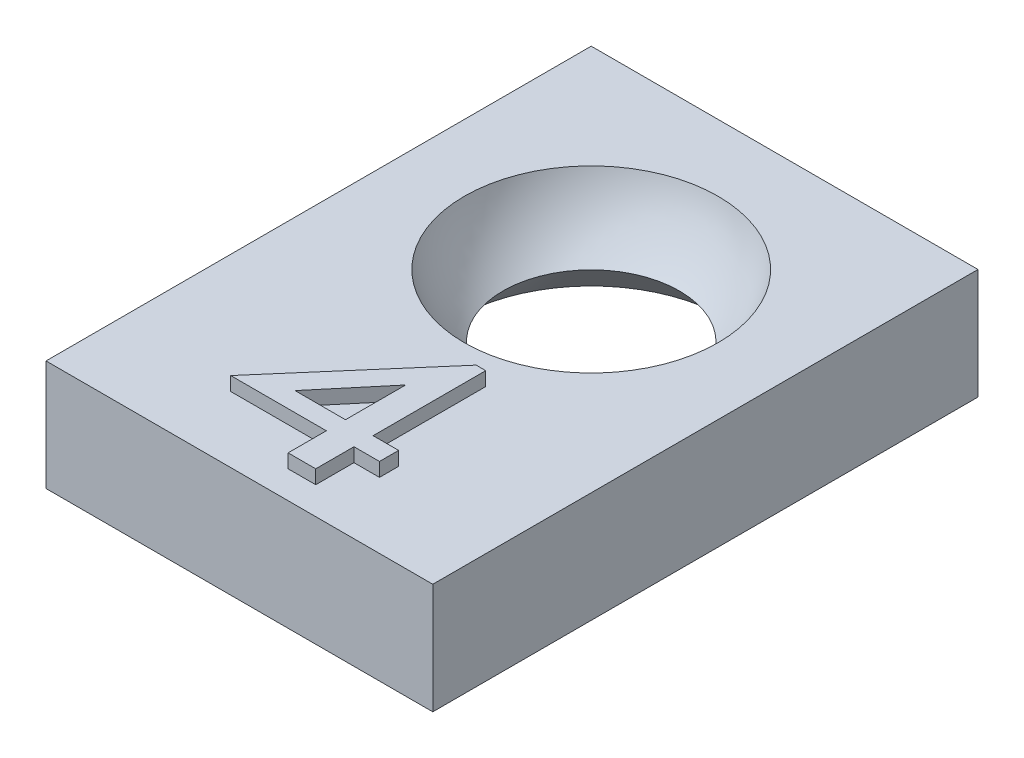
ISO-10303-21;
HEADER;
FILE_DESCRIPTION(('STEP AP214'),'2;1');
FILE_NAME('part.step','',(''),(''),'','','');
FILE_SCHEMA(('AUTOMOTIVE_DESIGN { 1 0 10303 214 1 1 1 1 }'));
ENDSEC;
DATA;
#1=APPLICATION_CONTEXT('core data for automotive mechanical design processes');
#2=APPLICATION_PROTOCOL_DEFINITION('international standard','automotive_design',2000,#1);
#3=PRODUCT_CONTEXT('',#1,'mechanical');
#4=PRODUCT('Part','Part','',(#3));
#5=PRODUCT_RELATED_PRODUCT_CATEGORY('part','',(#4));
#6=PRODUCT_DEFINITION_FORMATION('','',#4);
#7=PRODUCT_DEFINITION_CONTEXT('part definition',#1,'design');
#8=PRODUCT_DEFINITION('design','',#6,#7);
#9=PRODUCT_DEFINITION_SHAPE('','',#8);
#10=(LENGTH_UNIT() NAMED_UNIT(*) SI_UNIT(.MILLI.,.METRE.));
#11=(NAMED_UNIT(*) PLANE_ANGLE_UNIT() SI_UNIT($,.RADIAN.));
#12=(NAMED_UNIT(*) SI_UNIT($,.STERADIAN.) SOLID_ANGLE_UNIT());
#13=UNCERTAINTY_MEASURE_WITH_UNIT(LENGTH_MEASURE(1.E-05),#10,'distance_accuracy_value','');
#14=(GEOMETRIC_REPRESENTATION_CONTEXT(3) GLOBAL_UNCERTAINTY_ASSIGNED_CONTEXT((#13)) GLOBAL_UNIT_ASSIGNED_CONTEXT((#10,
#11,#12)) REPRESENTATION_CONTEXT('',''));
#15=CARTESIAN_POINT('',(0.,0.,0.));
#16=DIRECTION('',(0.,0.,1.));
#17=DIRECTION('',(1.,0.,0.));
#18=AXIS2_PLACEMENT_3D('',#15,#16,#17);
#19=CARTESIAN_POINT('',(0.,-15.5700000000001,1.90819582357449E-13));
#20=DIRECTION('',(0.,1.,0.));
#21=DIRECTION('',(-1.,0.,0.));
#22=AXIS2_PLACEMENT_3D('',#19,#20,#21);
#23=PLANE('',#22);
#24=CARTESIAN_POINT('',(-18.0191847198285,-15.5700000000003,-18.0208152801712));
#25=DIRECTION('',(0.,1.,0.));
#26=DIRECTION('',(0.,0.,1.));
#27=AXIS2_PLACEMENT_3D('',#24,#25,#26);
#28=CIRCLE('',#27,4.59211280349253);
#29=CARTESIAN_POINT('',(-18.0191847198285,-15.5700000000003,-22.6129280836637));
#30=VERTEX_POINT('',#29);
#31=EDGE_CURVE('E183',#30,#30,#28,.T.);
#32=ORIENTED_EDGE('',*,*,#31,.F.);
#33=EDGE_LOOP('',(#32));
#34=FACE_BOUND('',#33,.T.);
#35=DIRECTION('',(-1.,0.,0.));
#36=VECTOR('',#35,1.);
#37=CARTESIAN_POINT('',(-17.2563986058976,-15.5700000000002,-7.67139122876187));
#38=LINE('',#37,#36);
#39=CARTESIAN_POINT('',(-17.2563986058976,-15.5700000000002,-7.67139122876187));
#40=VERTEX_POINT('',#39);
#41=CARTESIAN_POINT('',(-20.717937067436,-15.5700000000002,-7.67139122876187));
#42=VERTEX_POINT('',#41);
#43=EDGE_CURVE('E229',#40,#42,#38,.T.);
#44=ORIENTED_EDGE('',*,*,#43,.T.);
#45=DIRECTION('',(0.65330188663375,0.,-0.757097513482103));
#46=VECTOR('',#45,1.);
#47=CARTESIAN_POINT('',(-20.717937067436,-15.5700000000002,-7.67139122876187));
#48=LINE('',#47,#46);
#49=CARTESIAN_POINT('',(-16.6025524520514,-15.5700000000002,-12.4406219979926));
#50=VERTEX_POINT('',#49);
#51=EDGE_CURVE('E257',#42,#50,#48,.T.);
#52=ORIENTED_EDGE('',*,*,#51,.T.);
#53=DIRECTION('',(1.,0.,0.));
#54=VECTOR('',#53,1.);
#55=CARTESIAN_POINT('',(-16.6025524520514,-15.5700000000002,-12.4406219979926));
#56=LINE('',#55,#54);
#57=CARTESIAN_POINT('',(-16.2563986058976,-15.5700000000002,-12.4406219979926));
#58=VERTEX_POINT('',#57);
#59=EDGE_CURVE('E224',#50,#58,#56,.T.);
#60=ORIENTED_EDGE('',*,*,#59,.T.);
#61=DIRECTION('',(0.,0.,1.));
#62=VECTOR('',#61,1.);
#63=CARTESIAN_POINT('',(-16.2563986058976,-15.5700000000002,-12.4406219979926));
#64=LINE('',#63,#62);
#65=CARTESIAN_POINT('',(-16.2563986058976,-15.5700000000002,-8.36369892106957));
#66=VERTEX_POINT('',#65);
#67=EDGE_CURVE('E262',#58,#66,#64,.T.);
#68=ORIENTED_EDGE('',*,*,#67,.T.);
#69=DIRECTION('',(1.,0.,0.));
#70=VECTOR('',#69,1.);
#71=CARTESIAN_POINT('',(-16.2563986058976,-15.5700000000002,-8.36369892106957));
#72=LINE('',#71,#70);
#73=CARTESIAN_POINT('',(-15.3333216828206,-15.5700000000002,-8.36369892106957));
#74=VERTEX_POINT('',#73);
#75=EDGE_CURVE('E265',#66,#74,#72,.T.);
#76=ORIENTED_EDGE('',*,*,#75,.T.);
#77=DIRECTION('',(0.,0.,1.));
#78=VECTOR('',#77,1.);
#79=CARTESIAN_POINT('',(-15.3333216828206,-15.5700000000002,-8.36369892106957));
#80=LINE('',#79,#78);
#81=CARTESIAN_POINT('',(-15.3333216828206,-15.5700000000002,-7.67139122876187));
#82=VERTEX_POINT('',#81);
#83=EDGE_CURVE('E268',#74,#82,#80,.T.);
#84=ORIENTED_EDGE('',*,*,#83,.T.);
#85=DIRECTION('',(-1.,0.,0.));
#86=VECTOR('',#85,1.);
#87=CARTESIAN_POINT('',(-15.3333216828206,-15.5700000000002,-7.67139122876187));
#88=LINE('',#87,#86);
#89=CARTESIAN_POINT('',(-16.2563986058976,-15.5700000000002,-7.67139122876187));
#90=VERTEX_POINT('',#89);
#91=EDGE_CURVE('E271',#82,#90,#88,.T.);
#92=ORIENTED_EDGE('',*,*,#91,.T.);
#93=DIRECTION('',(0.,0.,1.));
#94=VECTOR('',#93,1.);
#95=CARTESIAN_POINT('',(-16.2563986058976,-15.5700000000002,-7.67139122876187));
#96=LINE('',#95,#94);
#97=CARTESIAN_POINT('',(-16.2563986058976,-15.5700000000002,-6.28677584414649));
#98=VERTEX_POINT('',#97);
#99=EDGE_CURVE('E274',#90,#98,#96,.T.);
#100=ORIENTED_EDGE('',*,*,#99,.T.);
#101=DIRECTION('',(-1.,0.,0.));
#102=VECTOR('',#101,1.);
#103=CARTESIAN_POINT('',(-16.2563986058976,-15.5700000000002,-6.28677584414649));
#104=LINE('',#103,#102);
#105=CARTESIAN_POINT('',(-17.2563986058976,-15.5700000000002,-6.28677584414649));
#106=VERTEX_POINT('',#105);
#107=EDGE_CURVE('E277',#98,#106,#104,.T.);
#108=ORIENTED_EDGE('',*,*,#107,.T.);
#109=DIRECTION('',(0.,0.,-1.));
#110=VECTOR('',#109,1.);
#111=CARTESIAN_POINT('',(-17.2563986058976,-15.5700000000002,-6.28677584414649));
#112=LINE('',#111,#110);
#113=EDGE_CURVE('E213',#106,#40,#112,.T.);
#114=ORIENTED_EDGE('',*,*,#113,.T.);
#115=EDGE_LOOP('',(#44,#52,#60,#68,#76,#84,#92,#100,#108,#114));
#116=FACE_BOUND('',#115,.T.);
#117=DIRECTION('',(1.,0.,0.));
#118=VECTOR('',#117,1.);
#119=CARTESIAN_POINT('',(0.,-15.5700000000001,-5.28677584414649));
#120=LINE('',#119,#118);
#121=CARTESIAN_POINT('',(-25.0191847198285,-15.5700000000002,-5.28677584414648));
#122=VERTEX_POINT('',#121);
#123=CARTESIAN_POINT('',(-11.0191847198285,-15.5700000000002,-5.28677584414649));
#124=VERTEX_POINT('',#123);
#125=EDGE_CURVE('E62',#122,#124,#120,.T.);
#126=ORIENTED_EDGE('',*,*,#125,.T.);
#127=DIRECTION('',(0.,0.,-1.));
#128=VECTOR('',#127,1.);
#129=CARTESIAN_POINT('',(-11.0191847198285,-15.5700000000002,1.91788225319858E-13));
#130=LINE('',#129,#128);
#131=CARTESIAN_POINT('',(-11.0191847198285,-15.5700000000002,-25.0208152801712));
#132=VERTEX_POINT('',#131);
#133=EDGE_CURVE('E197',#124,#132,#130,.T.);
#134=ORIENTED_EDGE('',*,*,#133,.T.);
#135=DIRECTION('',(-1.,0.,0.));
#136=VECTOR('',#135,1.);
#137=CARTESIAN_POINT('',(-5.99999999999993,-15.5700000000002,-25.0208152801712));
#138=LINE('',#137,#136);
#139=CARTESIAN_POINT('',(-25.0191847198285,-15.5700000000003,-25.0208152801712));
#140=VERTEX_POINT('',#139);
#141=EDGE_CURVE('E199',#132,#140,#138,.T.);
#142=ORIENTED_EDGE('',*,*,#141,.T.);
#143=DIRECTION('',(0.,0.,1.));
#144=VECTOR('',#143,1.);
#145=CARTESIAN_POINT('',(-25.0191847198285,-15.5700000000002,0.));
#146=LINE('',#145,#144);
#147=EDGE_CURVE('E193',#140,#122,#146,.T.);
#148=ORIENTED_EDGE('',*,*,#147,.T.);
#149=EDGE_LOOP('',(#126,#134,#142,#148));
#150=FACE_BOUND('',#149,.T.);
#151=ADVANCED_FACE('F46',(#34,#116,#150),#23,.T.);
#152=CARTESIAN_POINT('',(0.,-19.5700000000001,2.04697370165263E-13));
#153=DIRECTION('',(0.,1.,0.));
#154=DIRECTION('',(-1.,0.,0.));
#155=AXIS2_PLACEMENT_3D('',#152,#153,#154);
#156=PLANE('',#155);
#157=CARTESIAN_POINT('',(-18.0191847198285,-19.5700000000003,-18.0208152801712));
#158=DIRECTION('',(0.,1.,0.));
#159=DIRECTION('',(0.,0.,1.));
#160=AXIS2_PLACEMENT_3D('',#157,#158,#159);
#161=CIRCLE('',#160,4.92500000000004);
#162=CARTESIAN_POINT('',(-18.0191847198285,-19.5700000000003,-22.9458152801712));
#163=VERTEX_POINT('',#162);
#164=EDGE_CURVE('E55',#163,#163,#161,.T.);
#165=ORIENTED_EDGE('',*,*,#164,.T.);
#166=EDGE_LOOP('',(#165));
#167=FACE_BOUND('',#166,.T.);
#168=DIRECTION('',(0.,0.,-1.));
#169=VECTOR('',#168,1.);
#170=CARTESIAN_POINT('',(-11.0191847198285,-19.5700000000006,-25.0208152801712));
#171=LINE('',#170,#169);
#172=CARTESIAN_POINT('',(-11.0191847198285,-19.5700000000005,-5.28677584414648));
#173=VERTEX_POINT('',#172);
#174=CARTESIAN_POINT('',(-11.0191847198285,-19.5700000000006,-25.0208152801712));
#175=VERTEX_POINT('',#174);
#176=EDGE_CURVE('E176',#173,#175,#171,.T.);
#177=ORIENTED_EDGE('',*,*,#176,.F.);
#178=DIRECTION('',(1.,0.,0.));
#179=VECTOR('',#178,1.);
#180=CARTESIAN_POINT('',(-25.0191847198285,-19.5700000000006,-5.28677584414648));
#181=LINE('',#180,#179);
#182=CARTESIAN_POINT('',(-25.0191847198285,-19.5700000000006,-5.28677584414648));
#183=VERTEX_POINT('',#182);
#184=EDGE_CURVE('E169',#183,#173,#181,.T.);
#185=ORIENTED_EDGE('',*,*,#184,.F.);
#186=DIRECTION('',(0.,0.,-1.));
#187=VECTOR('',#186,1.);
#188=CARTESIAN_POINT('',(-25.0191847198285,-19.5700000000002,0.));
#189=LINE('',#188,#187);
#190=CARTESIAN_POINT('',(-25.0191847198285,-19.5700000000003,-25.0208152801712));
#191=VERTEX_POINT('',#190);
#192=EDGE_CURVE('E181',#183,#191,#189,.T.);
#193=ORIENTED_EDGE('',*,*,#192,.T.);
#194=DIRECTION('',(1.,0.,0.));
#195=VECTOR('',#194,1.);
#196=CARTESIAN_POINT('',(-5.99999999999992,-19.5700000000002,-25.0208152801712));
#197=LINE('',#196,#195);
#198=EDGE_CURVE('E189',#191,#175,#197,.T.);
#199=ORIENTED_EDGE('',*,*,#198,.T.);
#200=EDGE_LOOP('',(#177,#185,#193,#199));
#201=FACE_BOUND('',#200,.T.);
#202=ADVANCED_FACE('F179',(#167,#201),#156,.F.);
#203=CARTESIAN_POINT('',(-5.99999999999981,-50.9988177425023,-25.0208152801711));
#204=DIRECTION('',(0.,0.,-1.));
#205=DIRECTION('',(0.,1.,0.));
#206=AXIS2_PLACEMENT_3D('',#203,#204,#205);
#207=PLANE('',#206);
#208=ORIENTED_EDGE('',*,*,#141,.F.);
#209=DIRECTION('',(0.,1.,0.));
#210=VECTOR('',#209,1.);
#211=CARTESIAN_POINT('',(-11.0191847198285,-19.5700000000006,-25.0208152801712));
#212=LINE('',#211,#210);
#213=EDGE_CURVE('E425',#175,#132,#212,.T.);
#214=ORIENTED_EDGE('',*,*,#213,.F.);
#215=ORIENTED_EDGE('',*,*,#198,.F.);
#216=DIRECTION('',(0.,1.,0.));
#217=VECTOR('',#216,1.);
#218=CARTESIAN_POINT('',(-25.0191847198284,-50.9988177425024,-25.0208152801711));
#219=LINE('',#218,#217);
#220=EDGE_CURVE('E188',#191,#140,#219,.T.);
#221=ORIENTED_EDGE('',*,*,#220,.T.);
#222=EDGE_LOOP('',(#208,#214,#215,#221));
#223=FACE_BOUND('',#222,.T.);
#224=ADVANCED_FACE('F324',(#223),#207,.T.);
#225=CARTESIAN_POINT('',(-25.0191847198284,-50.9988177425023,1.80390598819962E-13));
#226=DIRECTION('',(-1.,0.,0.));
#227=DIRECTION('',(0.,-1.,0.));
#228=AXIS2_PLACEMENT_3D('',#225,#226,#227);
#229=PLANE('',#228);
#230=ORIENTED_EDGE('',*,*,#192,.F.);
#231=DIRECTION('',(0.,1.,0.));
#232=VECTOR('',#231,1.);
#233=CARTESIAN_POINT('',(-25.0191847198285,-19.5700000000006,-5.28677584414648));
#234=LINE('',#233,#232);
#235=EDGE_CURVE('E166',#183,#122,#234,.T.);
#236=ORIENTED_EDGE('',*,*,#235,.T.);
#237=ORIENTED_EDGE('',*,*,#147,.F.);
#238=ORIENTED_EDGE('',*,*,#220,.F.);
#239=EDGE_LOOP('',(#230,#236,#237,#238));
#240=FACE_BOUND('',#239,.T.);
#241=ADVANCED_FACE('F186',(#240),#229,.T.);
#242=DIRECTION('',(0.,0.,-1.));
#243=VECTOR('',#242,1.);
#244=CARTESIAN_POINT('',(-17.2563986058976,-15.5700000000002,-8.36369892106957));
#245=LINE('',#244,#243);
#246=CARTESIAN_POINT('',(-17.2563986058976,-15.5700000000002,-8.36369892106957));
#247=VERTEX_POINT('',#246);
#248=CARTESIAN_POINT('',(-17.2563986058976,-15.5700000000002,-10.5427854595311));
#249=VERTEX_POINT('',#248);
#250=EDGE_CURVE('E191',#247,#249,#245,.T.);
#251=ORIENTED_EDGE('',*,*,#250,.T.);
#252=DIRECTION('',(-0.642468173982169,0.,0.766312368045836));
#253=VECTOR('',#252,1.);
#254=CARTESIAN_POINT('',(-17.2563986058976,-15.5700000000002,-10.5427854595311));
#255=LINE('',#254,#253);
#256=CARTESIAN_POINT('',(-19.0833216828206,-15.5700000000002,-8.36369892106957));
#257=VERTEX_POINT('',#256);
#258=EDGE_CURVE('E70',#249,#257,#255,.T.);
#259=ORIENTED_EDGE('',*,*,#258,.T.);
#260=DIRECTION('',(1.,0.,0.));
#261=VECTOR('',#260,1.);
#262=CARTESIAN_POINT('',(-19.0833216828206,-15.5700000000002,-8.36369892106957));
#263=LINE('',#262,#261);
#264=EDGE_CURVE('E210',#257,#247,#263,.T.);
#265=ORIENTED_EDGE('',*,*,#264,.T.);
#266=EDGE_LOOP('',(#251,#259,#265));
#267=FACE_BOUND('',#266,.T.);
#268=ADVANCED_FACE('F319',(#267),#23,.T.);
#269=CARTESIAN_POINT('',(0.,-15.0700000000001,0.));
#270=DIRECTION('',(0.,-1.,0.));
#271=DIRECTION('',(0.,0.,-1.));
#272=AXIS2_PLACEMENT_3D('',#269,#270,#271);
#273=PLANE('',#272);
#274=DIRECTION('',(0.65330188663375,0.,-0.757097513482103));
#275=VECTOR('',#274,1.);
#276=CARTESIAN_POINT('',(-20.717937067436,-15.0700000000002,-7.67139122876188));
#277=LINE('',#276,#275);
#278=CARTESIAN_POINT('',(-20.717937067436,-15.0700000000002,-7.67139122876188));
#279=VERTEX_POINT('',#278);
#280=CARTESIAN_POINT('',(-16.6025524520514,-15.0700000000002,-12.4406219979926));
#281=VERTEX_POINT('',#280);
#282=EDGE_CURVE('E225',#279,#281,#277,.T.);
#283=ORIENTED_EDGE('',*,*,#282,.F.);
#284=DIRECTION('',(-1.,0.,0.));
#285=VECTOR('',#284,1.);
#286=CARTESIAN_POINT('',(-17.2563986058976,-15.0700000000002,-7.67139122876188));
#287=LINE('',#286,#285);
#288=CARTESIAN_POINT('',(-17.2563986058976,-15.0700000000002,-7.67139122876188));
#289=VERTEX_POINT('',#288);
#290=EDGE_CURVE('E253',#289,#279,#287,.T.);
#291=ORIENTED_EDGE('',*,*,#290,.F.);
#292=DIRECTION('',(0.,0.,-1.));
#293=VECTOR('',#292,1.);
#294=CARTESIAN_POINT('',(-17.2563986058976,-15.0700000000002,-6.28677584414649));
#295=LINE('',#294,#293);
#296=CARTESIAN_POINT('',(-17.2563986058976,-15.0700000000002,-6.28677584414649));
#297=VERTEX_POINT('',#296);
#298=EDGE_CURVE('E250',#297,#289,#295,.T.);
#299=ORIENTED_EDGE('',*,*,#298,.F.);
#300=DIRECTION('',(-1.,0.,0.));
#301=VECTOR('',#300,1.);
#302=CARTESIAN_POINT('',(-16.2563986058976,-15.0700000000002,-6.28677584414649));
#303=LINE('',#302,#301);
#304=CARTESIAN_POINT('',(-16.2563986058976,-15.0700000000002,-6.28677584414649));
#305=VERTEX_POINT('',#304);
#306=EDGE_CURVE('E247',#305,#297,#303,.T.);
#307=ORIENTED_EDGE('',*,*,#306,.F.);
#308=DIRECTION('',(0.,0.,1.));
#309=VECTOR('',#308,1.);
#310=CARTESIAN_POINT('',(-16.2563986058976,-15.0700000000002,-7.67139122876188));
#311=LINE('',#310,#309);
#312=CARTESIAN_POINT('',(-16.2563986058976,-15.0700000000002,-7.67139122876188));
#313=VERTEX_POINT('',#312);
#314=EDGE_CURVE('E244',#313,#305,#311,.T.);
#315=ORIENTED_EDGE('',*,*,#314,.F.);
#316=DIRECTION('',(-1.,0.,0.));
#317=VECTOR('',#316,1.);
#318=CARTESIAN_POINT('',(-15.3333216828206,-15.0700000000002,-7.67139122876188));
#319=LINE('',#318,#317);
#320=CARTESIAN_POINT('',(-15.3333216828206,-15.0700000000002,-7.67139122876188));
#321=VERTEX_POINT('',#320);
#322=EDGE_CURVE('E241',#321,#313,#319,.T.);
#323=ORIENTED_EDGE('',*,*,#322,.F.);
#324=DIRECTION('',(0.,0.,1.));
#325=VECTOR('',#324,1.);
#326=CARTESIAN_POINT('',(-15.3333216828206,-15.0700000000002,-8.36369892106957));
#327=LINE('',#326,#325);
#328=CARTESIAN_POINT('',(-15.3333216828206,-15.0700000000002,-8.36369892106957));
#329=VERTEX_POINT('',#328);
#330=EDGE_CURVE('E238',#329,#321,#327,.T.);
#331=ORIENTED_EDGE('',*,*,#330,.F.);
#332=DIRECTION('',(1.,0.,0.));
#333=VECTOR('',#332,1.);
#334=CARTESIAN_POINT('',(-16.2563986058976,-15.0700000000002,-8.36369892106957));
#335=LINE('',#334,#333);
#336=CARTESIAN_POINT('',(-16.2563986058976,-15.0700000000002,-8.36369892106957));
#337=VERTEX_POINT('',#336);
#338=EDGE_CURVE('E235',#337,#329,#335,.T.);
#339=ORIENTED_EDGE('',*,*,#338,.F.);
#340=DIRECTION('',(0.,0.,1.));
#341=VECTOR('',#340,1.);
#342=CARTESIAN_POINT('',(-16.2563986058976,-15.0700000000002,-12.4406219979926));
#343=LINE('',#342,#341);
#344=CARTESIAN_POINT('',(-16.2563986058976,-15.0700000000002,-12.4406219979926));
#345=VERTEX_POINT('',#344);
#346=EDGE_CURVE('E232',#345,#337,#343,.T.);
#347=ORIENTED_EDGE('',*,*,#346,.F.);
#348=DIRECTION('',(1.,0.,0.));
#349=VECTOR('',#348,1.);
#350=CARTESIAN_POINT('',(-16.6025524520514,-15.0700000000002,-12.4406219979926));
#351=LINE('',#350,#349);
#352=EDGE_CURVE('E228',#281,#345,#351,.T.);
#353=ORIENTED_EDGE('',*,*,#352,.F.);
#354=EDGE_LOOP('',(#283,#291,#299,#307,#315,#323,#331,#339,#347,#353));
#355=FACE_BOUND('',#354,.T.);
#356=DIRECTION('',(1.,0.,0.));
#357=VECTOR('',#356,1.);
#358=CARTESIAN_POINT('',(-19.0833216828206,-15.0700000000002,-8.36369892106957));
#359=LINE('',#358,#357);
#360=CARTESIAN_POINT('',(-19.0833216828206,-15.0700000000002,-8.36369892106957));
#361=VERTEX_POINT('',#360);
#362=CARTESIAN_POINT('',(-17.2563986058976,-15.0700000000002,-8.36369892106957));
#363=VERTEX_POINT('',#362);
#364=EDGE_CURVE('E202',#361,#363,#359,.T.);
#365=ORIENTED_EDGE('',*,*,#364,.F.);
#366=DIRECTION('',(-0.642468173982169,0.,0.766312368045836));
#367=VECTOR('',#366,1.);
#368=CARTESIAN_POINT('',(-17.2563986058976,-15.0700000000002,-10.5427854595311));
#369=LINE('',#368,#367);
#370=CARTESIAN_POINT('',(-17.2563986058976,-15.0700000000002,-10.5427854595311));
#371=VERTEX_POINT('',#370);
#372=EDGE_CURVE('E207',#371,#361,#369,.T.);
#373=ORIENTED_EDGE('',*,*,#372,.F.);
#374=DIRECTION('',(0.,0.,-1.));
#375=VECTOR('',#374,1.);
#376=CARTESIAN_POINT('',(-17.2563986058976,-15.0700000000002,-8.36369892106957));
#377=LINE('',#376,#375);
#378=EDGE_CURVE('E204',#363,#371,#377,.T.);
#379=ORIENTED_EDGE('',*,*,#378,.F.);
#380=EDGE_LOOP('',(#365,#373,#379));
#381=FACE_BOUND('',#380,.T.);
#382=ADVANCED_FACE('F329',(#355,#381),#273,.F.);
#383=CARTESIAN_POINT('',(-20.717937067436,-15.0700000000002,-7.67139122876188));
#384=DIRECTION('',(-0.757097513482103,0.,-0.65330188663375));
#385=DIRECTION('',(-0.65330188663375,0.,0.757097513482103));
#386=AXIS2_PLACEMENT_3D('',#383,#384,#385);
#387=PLANE('',#386);
#388=ORIENTED_EDGE('',*,*,#51,.F.);
#389=DIRECTION('',(0.,-1.,0.));
#390=VECTOR('',#389,1.);
#391=CARTESIAN_POINT('',(-20.717937067436,-15.0700000000002,-7.67139122876188));
#392=LINE('',#391,#390);
#393=EDGE_CURVE('E214',#279,#42,#392,.T.);
#394=ORIENTED_EDGE('',*,*,#393,.F.);
#395=ORIENTED_EDGE('',*,*,#282,.T.);
#396=DIRECTION('',(0.,-1.,0.));
#397=VECTOR('',#396,1.);
#398=CARTESIAN_POINT('',(-16.6025524520514,-15.0700000000002,-12.4406219979926));
#399=LINE('',#398,#397);
#400=EDGE_CURVE('E256',#281,#50,#399,.T.);
#401=ORIENTED_EDGE('',*,*,#400,.T.);
#402=EDGE_LOOP('',(#388,#394,#395,#401));
#403=FACE_BOUND('',#402,.T.);
#404=ADVANCED_FACE('F336',(#403),#387,.T.);
#405=CARTESIAN_POINT('',(-17.2563986058976,-15.0700000000002,-7.67139122876188));
#406=DIRECTION('',(0.,0.,1.));
#407=DIRECTION('',(0.,-1.,0.));
#408=AXIS2_PLACEMENT_3D('',#405,#406,#407);
#409=PLANE('',#408);
#410=ORIENTED_EDGE('',*,*,#43,.F.);
#411=DIRECTION('',(0.,-1.,0.));
#412=VECTOR('',#411,1.);
#413=CARTESIAN_POINT('',(-17.2563986058976,-15.0700000000002,-7.67139122876188));
#414=LINE('',#413,#412);
#415=EDGE_CURVE('E286',#289,#40,#414,.T.);
#416=ORIENTED_EDGE('',*,*,#415,.F.);
#417=ORIENTED_EDGE('',*,*,#290,.T.);
#418=ORIENTED_EDGE('',*,*,#393,.T.);
#419=EDGE_LOOP('',(#410,#416,#417,#418));
#420=FACE_BOUND('',#419,.T.);
#421=ADVANCED_FACE('F367',(#420),#409,.T.);
#422=CARTESIAN_POINT('',(-17.2563986058976,-15.0700000000002,-6.28677584414649));
#423=DIRECTION('',(-1.,0.,0.));
#424=DIRECTION('',(0.,-1.,0.));
#425=AXIS2_PLACEMENT_3D('',#422,#423,#424);
#426=PLANE('',#425);
#427=ORIENTED_EDGE('',*,*,#113,.F.);
#428=DIRECTION('',(0.,-1.,0.));
#429=VECTOR('',#428,1.);
#430=CARTESIAN_POINT('',(-17.2563986058976,-15.0700000000002,-6.28677584414649));
#431=LINE('',#430,#429);
#432=EDGE_CURVE('E288',#297,#106,#431,.T.);
#433=ORIENTED_EDGE('',*,*,#432,.F.);
#434=ORIENTED_EDGE('',*,*,#298,.T.);
#435=ORIENTED_EDGE('',*,*,#415,.T.);
#436=EDGE_LOOP('',(#427,#433,#434,#435));
#437=FACE_BOUND('',#436,.T.);
#438=ADVANCED_FACE('F370',(#437),#426,.T.);
#439=CARTESIAN_POINT('',(-16.2563986058976,-15.0700000000002,-6.28677584414649));
#440=DIRECTION('',(0.,0.,1.));
#441=DIRECTION('',(0.,-1.,0.));
#442=AXIS2_PLACEMENT_3D('',#439,#440,#441);
#443=PLANE('',#442);
#444=ORIENTED_EDGE('',*,*,#107,.F.);
#445=DIRECTION('',(0.,-1.,0.));
#446=VECTOR('',#445,1.);
#447=CARTESIAN_POINT('',(-16.2563986058976,-15.0700000000002,-6.28677584414649));
#448=LINE('',#447,#446);
#449=EDGE_CURVE('E291',#305,#98,#448,.T.);
#450=ORIENTED_EDGE('',*,*,#449,.F.);
#451=ORIENTED_EDGE('',*,*,#306,.T.);
#452=ORIENTED_EDGE('',*,*,#432,.T.);
#453=EDGE_LOOP('',(#444,#450,#451,#452));
#454=FACE_BOUND('',#453,.T.);
#455=ADVANCED_FACE('F374',(#454),#443,.T.);
#456=CARTESIAN_POINT('',(-16.2563986058976,-15.0700000000002,-7.67139122876188));
#457=DIRECTION('',(1.,0.,0.));
#458=DIRECTION('',(0.,1.,0.));
#459=AXIS2_PLACEMENT_3D('',#456,#457,#458);
#460=PLANE('',#459);
#461=ORIENTED_EDGE('',*,*,#99,.F.);
#462=DIRECTION('',(0.,-1.,0.));
#463=VECTOR('',#462,1.);
#464=CARTESIAN_POINT('',(-16.2563986058976,-15.0700000000002,-7.67139122876188));
#465=LINE('',#464,#463);
#466=EDGE_CURVE('E293',#313,#90,#465,.T.);
#467=ORIENTED_EDGE('',*,*,#466,.F.);
#468=ORIENTED_EDGE('',*,*,#314,.T.);
#469=ORIENTED_EDGE('',*,*,#449,.T.);
#470=EDGE_LOOP('',(#461,#467,#468,#469));
#471=FACE_BOUND('',#470,.T.);
#472=ADVANCED_FACE('F378',(#471),#460,.T.);
#473=CARTESIAN_POINT('',(-15.3333216828206,-15.0700000000002,-7.67139122876188));
#474=DIRECTION('',(0.,0.,1.));
#475=DIRECTION('',(0.,-1.,0.));
#476=AXIS2_PLACEMENT_3D('',#473,#474,#475);
#477=PLANE('',#476);
#478=ORIENTED_EDGE('',*,*,#91,.F.);
#479=DIRECTION('',(0.,-1.,0.));
#480=VECTOR('',#479,1.);
#481=CARTESIAN_POINT('',(-15.3333216828206,-15.0700000000002,-7.67139122876188));
#482=LINE('',#481,#480);
#483=EDGE_CURVE('E295',#321,#82,#482,.T.);
#484=ORIENTED_EDGE('',*,*,#483,.F.);
#485=ORIENTED_EDGE('',*,*,#322,.T.);
#486=ORIENTED_EDGE('',*,*,#466,.T.);
#487=EDGE_LOOP('',(#478,#484,#485,#486));
#488=FACE_BOUND('',#487,.T.);
#489=ADVANCED_FACE('F382',(#488),#477,.T.);
#490=CARTESIAN_POINT('',(-15.3333216828206,-15.0700000000002,-8.36369892106957));
#491=DIRECTION('',(1.,0.,0.));
#492=DIRECTION('',(0.,1.,0.));
#493=AXIS2_PLACEMENT_3D('',#490,#491,#492);
#494=PLANE('',#493);
#495=ORIENTED_EDGE('',*,*,#83,.F.);
#496=DIRECTION('',(0.,-1.,0.));
#497=VECTOR('',#496,1.);
#498=CARTESIAN_POINT('',(-15.3333216828206,-15.0700000000002,-8.36369892106957));
#499=LINE('',#498,#497);
#500=EDGE_CURVE('E297',#329,#74,#499,.T.);
#501=ORIENTED_EDGE('',*,*,#500,.F.);
#502=ORIENTED_EDGE('',*,*,#330,.T.);
#503=ORIENTED_EDGE('',*,*,#483,.T.);
#504=EDGE_LOOP('',(#495,#501,#502,#503));
#505=FACE_BOUND('',#504,.T.);
#506=ADVANCED_FACE('F386',(#505),#494,.T.);
#507=CARTESIAN_POINT('',(-16.2563986058976,-15.0700000000002,-8.36369892106957));
#508=DIRECTION('',(0.,0.,-1.));
#509=DIRECTION('',(0.,1.,0.));
#510=AXIS2_PLACEMENT_3D('',#507,#508,#509);
#511=PLANE('',#510);
#512=ORIENTED_EDGE('',*,*,#75,.F.);
#513=DIRECTION('',(0.,-1.,0.));
#514=VECTOR('',#513,1.);
#515=CARTESIAN_POINT('',(-16.2563986058976,-15.0700000000002,-8.36369892106957));
#516=LINE('',#515,#514);
#517=EDGE_CURVE('E299',#337,#66,#516,.T.);
#518=ORIENTED_EDGE('',*,*,#517,.F.);
#519=ORIENTED_EDGE('',*,*,#338,.T.);
#520=ORIENTED_EDGE('',*,*,#500,.T.);
#521=EDGE_LOOP('',(#512,#518,#519,#520));
#522=FACE_BOUND('',#521,.T.);
#523=ADVANCED_FACE('F390',(#522),#511,.T.);
#524=CARTESIAN_POINT('',(-16.2563986058976,-15.0700000000002,-12.4406219979926));
#525=DIRECTION('',(1.,0.,0.));
#526=DIRECTION('',(0.,1.,0.));
#527=AXIS2_PLACEMENT_3D('',#524,#525,#526);
#528=PLANE('',#527);
#529=ORIENTED_EDGE('',*,*,#67,.F.);
#530=DIRECTION('',(0.,-1.,0.));
#531=VECTOR('',#530,1.);
#532=CARTESIAN_POINT('',(-16.2563986058976,-15.0700000000002,-12.4406219979926));
#533=LINE('',#532,#531);
#534=EDGE_CURVE('E301',#345,#58,#533,.T.);
#535=ORIENTED_EDGE('',*,*,#534,.F.);
#536=ORIENTED_EDGE('',*,*,#346,.T.);
#537=ORIENTED_EDGE('',*,*,#517,.T.);
#538=EDGE_LOOP('',(#529,#535,#536,#537));
#539=FACE_BOUND('',#538,.T.);
#540=ADVANCED_FACE('F394',(#539),#528,.T.);
#541=CARTESIAN_POINT('',(-16.6025524520514,-15.0700000000002,-12.4406219979926));
#542=DIRECTION('',(0.,0.,-1.));
#543=DIRECTION('',(0.,1.,0.));
#544=AXIS2_PLACEMENT_3D('',#541,#542,#543);
#545=PLANE('',#544);
#546=ORIENTED_EDGE('',*,*,#59,.F.);
#547=ORIENTED_EDGE('',*,*,#400,.F.);
#548=ORIENTED_EDGE('',*,*,#352,.T.);
#549=ORIENTED_EDGE('',*,*,#534,.T.);
#550=EDGE_LOOP('',(#546,#547,#548,#549));
#551=FACE_BOUND('',#550,.T.);
#552=ADVANCED_FACE('F365',(#551),#545,.T.);
#553=CARTESIAN_POINT('',(-19.0833216828206,-15.0700000000002,-8.36369892106957));
#554=DIRECTION('',(0.,0.,-1.));
#555=DIRECTION('',(0.,1.,0.));
#556=AXIS2_PLACEMENT_3D('',#553,#554,#555);
#557=PLANE('',#556);
#558=ORIENTED_EDGE('',*,*,#264,.F.);
#559=DIRECTION('',(0.,-1.,0.));
#560=VECTOR('',#559,1.);
#561=CARTESIAN_POINT('',(-19.0833216828206,-15.0700000000002,-8.36369892106957));
#562=LINE('',#561,#560);
#563=EDGE_CURVE('E209',#361,#257,#562,.T.);
#564=ORIENTED_EDGE('',*,*,#563,.F.);
#565=ORIENTED_EDGE('',*,*,#364,.T.);
#566=DIRECTION('',(0.,-1.,0.));
#567=VECTOR('',#566,1.);
#568=CARTESIAN_POINT('',(-17.2563986058976,-15.0700000000002,-8.36369892106957));
#569=LINE('',#568,#567);
#570=EDGE_CURVE('E221',#363,#247,#569,.T.);
#571=ORIENTED_EDGE('',*,*,#570,.T.);
#572=EDGE_LOOP('',(#558,#564,#565,#571));
#573=FACE_BOUND('',#572,.T.);
#574=ADVANCED_FACE('F346',(#573),#557,.T.);
#575=CARTESIAN_POINT('',(-17.2563986058976,-15.0700000000002,-8.36369892106957));
#576=DIRECTION('',(-1.,0.,0.));
#577=DIRECTION('',(0.,-1.,0.));
#578=AXIS2_PLACEMENT_3D('',#575,#576,#577);
#579=PLANE('',#578);
#580=ORIENTED_EDGE('',*,*,#250,.F.);
#581=ORIENTED_EDGE('',*,*,#570,.F.);
#582=ORIENTED_EDGE('',*,*,#378,.T.);
#583=DIRECTION('',(0.,-1.,0.));
#584=VECTOR('',#583,1.);
#585=CARTESIAN_POINT('',(-17.2563986058976,-15.0700000000002,-10.5427854595311));
#586=LINE('',#585,#584);
#587=EDGE_CURVE('E219',#371,#249,#586,.T.);
#588=ORIENTED_EDGE('',*,*,#587,.T.);
#589=EDGE_LOOP('',(#580,#581,#582,#588));
#590=FACE_BOUND('',#589,.T.);
#591=ADVANCED_FACE('F343',(#590),#579,.T.);
#592=CARTESIAN_POINT('',(-17.2563986058976,-15.0700000000002,-10.5427854595311));
#593=DIRECTION('',(0.766312368045836,0.,0.642468173982169));
#594=DIRECTION('',(0.642468173982169,0.,-0.766312368045836));
#595=AXIS2_PLACEMENT_3D('',#592,#593,#594);
#596=PLANE('',#595);
#597=ORIENTED_EDGE('',*,*,#258,.F.);
#598=ORIENTED_EDGE('',*,*,#587,.F.);
#599=ORIENTED_EDGE('',*,*,#372,.T.);
#600=ORIENTED_EDGE('',*,*,#563,.T.);
#601=EDGE_LOOP('',(#597,#598,#599,#600));
#602=FACE_BOUND('',#601,.T.);
#603=ADVANCED_FACE('F351',(#602),#596,.T.);
#604=CARTESIAN_POINT('',(-11.0191847198285,-19.5700000000006,-25.0208152801712));
#605=DIRECTION('',(1.,0.,0.));
#606=DIRECTION('',(0.,1.,0.));
#607=AXIS2_PLACEMENT_3D('',#604,#605,#606);
#608=PLANE('',#607);
#609=DIRECTION('',(0.,1.,0.));
#610=VECTOR('',#609,1.);
#611=CARTESIAN_POINT('',(-11.0191847198285,-19.5700000000005,-5.28677584414648));
#612=LINE('',#611,#610);
#613=EDGE_CURVE('E175',#173,#124,#612,.T.);
#614=ORIENTED_EDGE('',*,*,#613,.F.);
#615=ORIENTED_EDGE('',*,*,#176,.T.);
#616=ORIENTED_EDGE('',*,*,#213,.T.);
#617=ORIENTED_EDGE('',*,*,#133,.F.);
#618=EDGE_LOOP('',(#614,#615,#616,#617));
#619=FACE_BOUND('',#618,.T.);
#620=ADVANCED_FACE('F353',(#619),#608,.T.);
#621=CARTESIAN_POINT('',(-25.0191847198285,-19.5700000000006,-5.28677584414648));
#622=DIRECTION('',(0.,0.,1.));
#623=DIRECTION('',(0.,-1.,0.));
#624=AXIS2_PLACEMENT_3D('',#621,#622,#623);
#625=PLANE('',#624);
#626=ORIENTED_EDGE('',*,*,#235,.F.);
#627=ORIENTED_EDGE('',*,*,#184,.T.);
#628=ORIENTED_EDGE('',*,*,#613,.T.);
#629=ORIENTED_EDGE('',*,*,#125,.F.);
#630=EDGE_LOOP('',(#626,#627,#628,#629));
#631=FACE_BOUND('',#630,.T.);
#632=ADVANCED_FACE('F168',(#631),#625,.T.);
#633=CARTESIAN_POINT('',(-18.0191847198285,-14.3075000000003,-18.0208152801712));
#634=DIRECTION('',(0.,1.,0.));
#635=DIRECTION('',(0.,0.,-1.));
#636=AXIS2_PLACEMENT_3D('',#633,#634,#635);
#637=SPHERICAL_SURFACE('',#636,4.7625);
#638=CARTESIAN_POINT('',(-18.0191847198285,-17.8396153626244,-18.0208152801712));
#639=DIRECTION('',(0.,-1.,0.));
#640=DIRECTION('',(0.,0.,-1.));
#641=AXIS2_PLACEMENT_3D('',#638,#639,#640);
#642=CIRCLE('',#641,3.19461536262416);
#643=CARTESIAN_POINT('',(-18.0191847198285,-17.8396153626244,-21.2154306427954));
#644=VERTEX_POINT('',#643);
#645=EDGE_CURVE('E12',#644,#644,#642,.T.);
#646=CARTESIAN_POINT('',(-18.0191847198285,-17.8396153626244,-21.2154306427954));
#647=CARTESIAN_POINT('',(-18.0191847198285,-17.8207395359301,-21.2363006768642));
#648=CARTESIAN_POINT('',(-18.0191847198285,-17.8016786985722,-21.2570033772073));
#649=CARTESIAN_POINT('',(-18.0191847198285,-17.7631930816395,-21.2980676901655));
#650=CARTESIAN_POINT('',(-18.0191847198285,-17.7437683020648,-21.3184293027805));
#651=CARTESIAN_POINT('',(-18.0191847198285,-17.7045608798093,-21.3588050200054));
#652=CARTESIAN_POINT('',(-18.0191847198285,-17.6847782371285,-21.3788191246154));
#653=CARTESIAN_POINT('',(-18.0191847198285,-17.6448613108523,-21.4184935434567));
#654=CARTESIAN_POINT('',(-18.0191847198285,-17.624727027257,-21.438153857688));
#655=CARTESIAN_POINT('',(-18.0191847198285,-17.584113143619,-21.4771145168652));
#656=CARTESIAN_POINT('',(-18.0191847198285,-17.5636335435764,-21.496414861811));
#657=CARTESIAN_POINT('',(-18.0191847198285,-17.5223354622098,-21.5346495186745));
#658=CARTESIAN_POINT('',(-18.0191847198285,-17.5015169808858,-21.5535838305922));
#659=CARTESIAN_POINT('',(-18.0191847198285,-17.4595476780093,-21.591080472112));
#660=CARTESIAN_POINT('',(-18.0191847198285,-17.4383968564568,-21.6096428017142));
#661=CARTESIAN_POINT('',(-18.0191847198285,-17.3957695187559,-21.6463896463407));
#662=CARTESIAN_POINT('',(-18.0191847198285,-17.3742930026074,-21.6645741613652));
#663=CARTESIAN_POINT('',(-18.0191847198285,-17.331021023638,-21.7005596632439));
#664=CARTESIAN_POINT('',(-18.0191847198285,-17.3092255608171,-21.7183606500981));
#665=CARTESIAN_POINT('',(-18.0191847198285,-17.2653225366507,-21.7535735025596));
#666=CARTESIAN_POINT('',(-18.0191847198285,-17.2432149753054,-21.7709853681667));
#667=CARTESIAN_POINT('',(-18.0191847198285,-17.1986947002967,-21.8054145073161));
#668=CARTESIAN_POINT('',(-18.0191847198285,-17.1762819866335,-21.8224317808583));
#669=CARTESIAN_POINT('',(-18.0191847198285,-17.1311584490754,-21.8560663890418));
#670=CARTESIAN_POINT('',(-18.0191847198285,-17.1084476251807,-21.8726837236832));
#671=CARTESIAN_POINT('',(-18.0191847198285,-17.0627350029122,-21.9055132328898));
#672=CARTESIAN_POINT('',(-18.0191847198285,-17.0397332045384,-21.9217254074551));
#673=CARTESIAN_POINT('',(-18.0191847198285,-16.9934458604889,-21.9537395026361));
#674=CARTESIAN_POINT('',(-18.0191847198285,-16.9701603148131,-21.9695414232517));
#675=CARTESIAN_POINT('',(-18.0191847198285,-16.92331279249,-22.0007300455618));
#676=CARTESIAN_POINT('',(-18.0191847198285,-16.8997508158427,-22.0161167472562));
#677=CARTESIAN_POINT('',(-18.0191847198285,-16.8523578347617,-22.0464700972141));
#678=CARTESIAN_POINT('',(-18.0191847198285,-16.828526830328,-22.0614367454776));
#679=CARTESIAN_POINT('',(-18.0191847198285,-16.7806032813882,-22.0909452860451));
#680=CARTESIAN_POINT('',(-18.0191847198285,-16.7565107368821,-22.1054871783492));
#681=CARTESIAN_POINT('',(-18.0191847198285,-16.7080716776873,-22.1341416379277));
#682=CARTESIAN_POINT('',(-18.0191847198285,-16.6837251629986,-22.1482542052021));
#683=CARTESIAN_POINT('',(-18.0191847198285,-16.6347858131263,-22.1760455805456));
#684=CARTESIAN_POINT('',(-18.0191847198285,-16.6101929779425,-22.1897243886146));
#685=CARTESIAN_POINT('',(-18.0191847198285,-16.5607687141616,-22.2166439476586));
#686=CARTESIAN_POINT('',(-18.0191847198285,-16.5359372855643,-22.2298846986336));
#687=CARTESIAN_POINT('',(-18.0191847198285,-16.4860436370039,-22.2559239832387));
#688=CARTESIAN_POINT('',(-18.0191847198285,-16.4609814170408,-22.2687225168688));
#689=CARTESIAN_POINT('',(-18.0191847198285,-16.4106340603112,-22.2938733454785));
#690=CARTESIAN_POINT('',(-18.0191847198285,-16.3853489235447,-22.306225640458));
#691=CARTESIAN_POINT('',(-18.0191847198285,-16.3345636778112,-22.3304801106686));
#692=CARTESIAN_POINT('',(-18.0191847198285,-16.3090635688442,-22.3423822858998));
#693=CARTESIAN_POINT('',(-18.0191847198285,-16.2578563908575,-22.365732776945));
#694=CARTESIAN_POINT('',(-18.0191847198285,-16.2321493218377,-22.3771810927591));
#695=CARTESIAN_POINT('',(-18.0191847198285,-16.1805363009188,-22.3996202679003));
#696=CARTESIAN_POINT('',(-18.0191847198285,-16.1546303490197,-22.4106111272274));
#697=CARTESIAN_POINT('',(-18.0191847198285,-16.102627702009,-22.4321319360728));
#698=CARTESIAN_POINT('',(-18.0191847198285,-16.0765310068974,-22.442661885591));
#699=CARTESIAN_POINT('',(-18.0191847198285,-16.0241550730439,-22.4632575662591));
#700=CARTESIAN_POINT('',(-18.0191847198285,-15.997875834302,-22.473323297409));
#701=CARTESIAN_POINT('',(-18.0191847198285,-15.9451430701865,-22.4929873788462));
#702=CARTESIAN_POINT('',(-18.0191847198285,-15.9186895448129,-22.5025857291336));
#703=CARTESIAN_POINT('',(-18.0191847198285,-15.8656165189655,-22.5213120324281));
#704=CARTESIAN_POINT('',(-18.0191847198285,-15.8389970184917,-22.5304399854351));
#705=CARTESIAN_POINT('',(-18.0191847198285,-15.7856004069756,-22.5482226284425));
#706=CARTESIAN_POINT('',(-18.0191847198285,-15.7588232959333,-22.5568773184429));
#707=CARTESIAN_POINT('',(-18.0191847198285,-15.7051198741585,-22.5737107076152));
#708=CARTESIAN_POINT('',(-18.0191847198285,-15.678193563426,-22.5818894067872));
#709=CARTESIAN_POINT('',(-18.0191847198285,-15.6242002118758,-22.5977682763247));
#710=CARTESIAN_POINT('',(-18.0191847198285,-15.5971331710581,-22.6054684466903));
#711=CARTESIAN_POINT('',(-18.0191847198285,-15.5700000000003,-22.6129280836637));
#712=B_SPLINE_CURVE_WITH_KNOTS('',3,(#646,#647,#648,#649,#650,#651,#652,#653,#654,#655,#656,
#657,#658,#659,#660,#661,#662,#663,#664,#665,#666,#667,#668,#669,#670,#671,#672,#673,#674,#675,
#676,#677,#678,#679,#680,#681,#682,#683,#684,#685,#686,#687,#688,#689,#690,#691,#692,#693,#694,
#695,#696,#697,#698,#699,#700,#701,#702,#703,#704,#705,#706,#707,#708,#709,#710,#711),
.UNSPECIFIED.,.F.,.F.,(4,2,2,2,2,2,2,2,2,2,2,2,2,2,2,2,2,2,2,2,2,2,2,2,2,2,2,2,2,2,2,2,4),(0.,
0.0844186564101601,0.168837312820322,0.253255969230484,0.337674625640647,0.422093282050808,
0.506511938460967,0.59093059487113,0.675349251281291,0.759767907691451,0.844186564101613,
0.928605220511774,1.01302387692194,1.0974425333321,1.18186118974226,1.26627984615242,
1.35069850256258,1.43511715897274,1.5195358153829,1.60395447179306,1.68837312820323,
1.77279178461339,1.85721044102355,1.94162909743371,2.02604775384387,2.11046641025403,
2.19488506666419,2.27930372307436,2.36372237948452,2.44814103589468,2.53255969230484,
2.616978348715,2.70139700512516),.UNSPECIFIED.);
#713=EDGE_CURVE('BSEAM308',#644,#30,#712,.T.);
#714=ORIENTED_EDGE('',*,*,#645,.T.);
#715=ORIENTED_EDGE('',*,*,#31,.T.);
#716=ORIENTED_EDGE('',*,*,#713,.T.);
#717=ORIENTED_EDGE('',*,*,#713,.F.);
#718=EDGE_LOOP('',(#714,#716,#715,#717));
#719=FACE_BOUND('',#718,.T.);
#720=ADVANCED_FACE('F308',(#719),#637,.F.);
#721=CARTESIAN_POINT('',(-18.0191847198285,-19.5700000000003,-18.0208152801712));
#722=DIRECTION('',(0.,-1.,0.));
#723=DIRECTION('',(0.,0.,-1.));
#724=AXIS2_PLACEMENT_3D('',#721,#722,#723);
#725=CONICAL_SURFACE('',#724,4.92500000000003,0.785398163397454);
#726=CARTESIAN_POINT('',(-18.0191847198285,-17.8396153626244,-21.2154306427954));
#727=CARTESIAN_POINT('',(-18.0191847198285,-17.8576402025971,-21.233455482768));
#728=CARTESIAN_POINT('',(-18.0191847198285,-17.8756650425698,-21.2514803227407));
#729=CARTESIAN_POINT('',(-18.0191847198285,-17.9117147225151,-21.287530002686));
#730=CARTESIAN_POINT('',(-18.0191847198285,-17.9297395624878,-21.3055548426587));
#731=CARTESIAN_POINT('',(-18.0191847198285,-17.9657892424331,-21.341604522604));
#732=CARTESIAN_POINT('',(-18.0191847198285,-17.9838140824058,-21.3596293625767));
#733=CARTESIAN_POINT('',(-18.0191847198285,-18.0198637623511,-21.395679042522));
#734=CARTESIAN_POINT('',(-18.0191847198285,-18.0378886023238,-21.4137038824947));
#735=CARTESIAN_POINT('',(-18.0191847198285,-18.0739382822691,-21.44975356244));
#736=CARTESIAN_POINT('',(-18.0191847198285,-18.0919631222417,-21.4677784024127));
#737=CARTESIAN_POINT('',(-18.0191847198285,-18.1280128021871,-21.503828082358));
#738=CARTESIAN_POINT('',(-18.0191847198285,-18.1460376421597,-21.5218529223307));
#739=CARTESIAN_POINT('',(-18.0191847198285,-18.1820873221051,-21.557902602276));
#740=CARTESIAN_POINT('',(-18.0191847198285,-18.2001121620777,-21.5759274422487));
#741=CARTESIAN_POINT('',(-18.0191847198285,-18.2361618420231,-21.611977122194));
#742=CARTESIAN_POINT('',(-18.0191847198285,-18.2541866819957,-21.6300019621667));
#743=CARTESIAN_POINT('',(-18.0191847198285,-18.2902363619411,-21.666051642112));
#744=CARTESIAN_POINT('',(-18.0191847198285,-18.3082612019137,-21.6840764820847));
#745=CARTESIAN_POINT('',(-18.0191847198285,-18.3443108818591,-21.72012616203));
#746=CARTESIAN_POINT('',(-18.0191847198285,-18.3623357218317,-21.7381510020027));
#747=CARTESIAN_POINT('',(-18.0191847198285,-18.398385401777,-21.774200681948));
#748=CARTESIAN_POINT('',(-18.0191847198285,-18.4164102417497,-21.7922255219206));
#749=CARTESIAN_POINT('',(-18.0191847198285,-18.452459921695,-21.828275201866));
#750=CARTESIAN_POINT('',(-18.0191847198285,-18.4704847616677,-21.8463000418386));
#751=CARTESIAN_POINT('',(-18.0191847198285,-18.506534441613,-21.882349721784));
#752=CARTESIAN_POINT('',(-18.0191847198285,-18.5245592815857,-21.9003745617566));
#753=CARTESIAN_POINT('',(-18.0191847198285,-18.560608961531,-21.936424241702));
#754=CARTESIAN_POINT('',(-18.0191847198285,-18.5786338015037,-21.9544490816746));
#755=CARTESIAN_POINT('',(-18.0191847198285,-18.614683481449,-21.99049876162));
#756=CARTESIAN_POINT('',(-18.0191847198285,-18.6327083214217,-22.0085236015926));
#757=CARTESIAN_POINT('',(-18.0191847198285,-18.668758001367,-22.044573281538));
#758=CARTESIAN_POINT('',(-18.0191847198285,-18.6867828413397,-22.0625981215106));
#759=CARTESIAN_POINT('',(-18.0191847198285,-18.722832521285,-22.098647801456));
#760=CARTESIAN_POINT('',(-18.0191847198285,-18.7408573612577,-22.1166726414286));
#761=CARTESIAN_POINT('',(-18.0191847198285,-18.776907041203,-22.152722321374));
#762=CARTESIAN_POINT('',(-18.0191847198285,-18.7949318811757,-22.1707471613466));
#763=CARTESIAN_POINT('',(-18.0191847198285,-18.830981561121,-22.2067968412919));
#764=CARTESIAN_POINT('',(-18.0191847198285,-18.8490064010937,-22.2248216812646));
#765=CARTESIAN_POINT('',(-18.0191847198285,-18.885056081039,-22.2608713612099));
#766=CARTESIAN_POINT('',(-18.0191847198285,-18.9030809210117,-22.2788962011826));
#767=CARTESIAN_POINT('',(-18.0191847198285,-18.939130600957,-22.3149458811279));
#768=CARTESIAN_POINT('',(-18.0191847198285,-18.9571554409297,-22.3329707211006));
#769=CARTESIAN_POINT('',(-18.0191847198285,-18.993205120875,-22.3690204010459));
#770=CARTESIAN_POINT('',(-18.0191847198285,-19.0112299608477,-22.3870452410186));
#771=CARTESIAN_POINT('',(-18.0191847198285,-19.047279640793,-22.4230949209639));
#772=CARTESIAN_POINT('',(-18.0191847198285,-19.0653044807657,-22.4411197609366));
#773=CARTESIAN_POINT('',(-18.0191847198285,-19.101354160711,-22.4771694408819));
#774=CARTESIAN_POINT('',(-18.0191847198285,-19.1193790006836,-22.4951942808546));
#775=CARTESIAN_POINT('',(-18.0191847198285,-19.155428680629,-22.5312439607999));
#776=CARTESIAN_POINT('',(-18.0191847198285,-19.1734535206016,-22.5492688007726));
#777=CARTESIAN_POINT('',(-18.0191847198285,-19.209503200547,-22.5853184807179));
#778=CARTESIAN_POINT('',(-18.0191847198285,-19.2275280405196,-22.6033433206906));
#779=CARTESIAN_POINT('',(-18.0191847198285,-19.263577720465,-22.6393930006359));
#780=CARTESIAN_POINT('',(-18.0191847198285,-19.2816025604376,-22.6574178406086));
#781=CARTESIAN_POINT('',(-18.0191847198285,-19.317652240383,-22.6934675205539));
#782=CARTESIAN_POINT('',(-18.0191847198285,-19.3356770803556,-22.7114923605266));
#783=CARTESIAN_POINT('',(-18.0191847198285,-19.3717267603009,-22.7475420404719));
#784=CARTESIAN_POINT('',(-18.0191847198285,-19.3897516002736,-22.7655668804446));
#785=CARTESIAN_POINT('',(-18.0191847198285,-19.4258012802189,-22.8016165603899));
#786=CARTESIAN_POINT('',(-18.0191847198285,-19.4438261201916,-22.8196414003625));
#787=CARTESIAN_POINT('',(-18.0191847198285,-19.4798758001369,-22.8556910803079));
#788=CARTESIAN_POINT('',(-18.0191847198285,-19.4979006401096,-22.8737159202805));
#789=CARTESIAN_POINT('',(-18.0191847198285,-19.5339503200549,-22.9097656002259));
#790=CARTESIAN_POINT('',(-18.0191847198285,-19.5519751600276,-22.9277904401985));
#791=CARTESIAN_POINT('',(-18.0191847198285,-19.5700000000003,-22.9458152801712));
#792=B_SPLINE_CURVE_WITH_KNOTS('',3,(#726,#727,#728,#729,#730,#731,#732,#733,#734,#735,#736,
#737,#738,#739,#740,#741,#742,#743,#744,#745,#746,#747,#748,#749,#750,#751,#752,#753,#754,#755,
#756,#757,#758,#759,#760,#761,#762,#763,#764,#765,#766,#767,#768,#769,#770,#771,#772,#773,#774,
#775,#776,#777,#778,#779,#780,#781,#782,#783,#784,#785,#786,#787,#788,#789,#790,#791),
.UNSPECIFIED.,.F.,.F.,(4,2,2,2,2,2,2,2,2,2,2,2,2,2,2,2,2,2,2,2,2,2,2,2,2,2,2,2,2,2,2,2,4),(0.,
0.0764729194468429,0.152945838893686,0.229418758340529,0.305891677787372,0.382364597234212,
0.458837516681055,0.535310436127898,0.611783355574739,0.688256275021579,0.764729194468422,
0.841202113915262,0.917675033362108,0.994147952808948,1.07062087225579,1.14709379170263,
1.22356671114948,1.30003963059632,1.37651255004316,1.45298546949,1.52945838893685,
1.60593130838369,1.68240422783053,1.75887714727737,1.83535006672421,1.91182298617106,
1.9882959056179,2.06476882506474,2.14124174451158,2.21771466395843,2.29418758340527,
2.37066050285211,2.44713342229895),.UNSPECIFIED.);
#793=EDGE_CURVE('BSEAM49',#644,#163,#792,.T.);
#794=ORIENTED_EDGE('',*,*,#645,.F.);
#795=ORIENTED_EDGE('',*,*,#164,.F.);
#796=ORIENTED_EDGE('',*,*,#793,.T.);
#797=ORIENTED_EDGE('',*,*,#793,.F.);
#798=EDGE_LOOP('',(#794,#796,#795,#797));
#799=FACE_BOUND('',#798,.T.);
#800=ADVANCED_FACE('F49',(#799),#725,.F.);
#801=CLOSED_SHELL('',(#151,#202,#224,#241,#268,#382,#404,#421,#438,#455,#472,#489,#506,#523,
#540,#552,#574,#591,#603,#620,#632,#720,#800));
#802=MANIFOLD_SOLID_BREP('B2',#801);
#803=ADVANCED_BREP_SHAPE_REPRESENTATION('',(#18,#802),#14);
#804=SHAPE_DEFINITION_REPRESENTATION(#9,#803);
ENDSEC;
END-ISO-10303-21;
